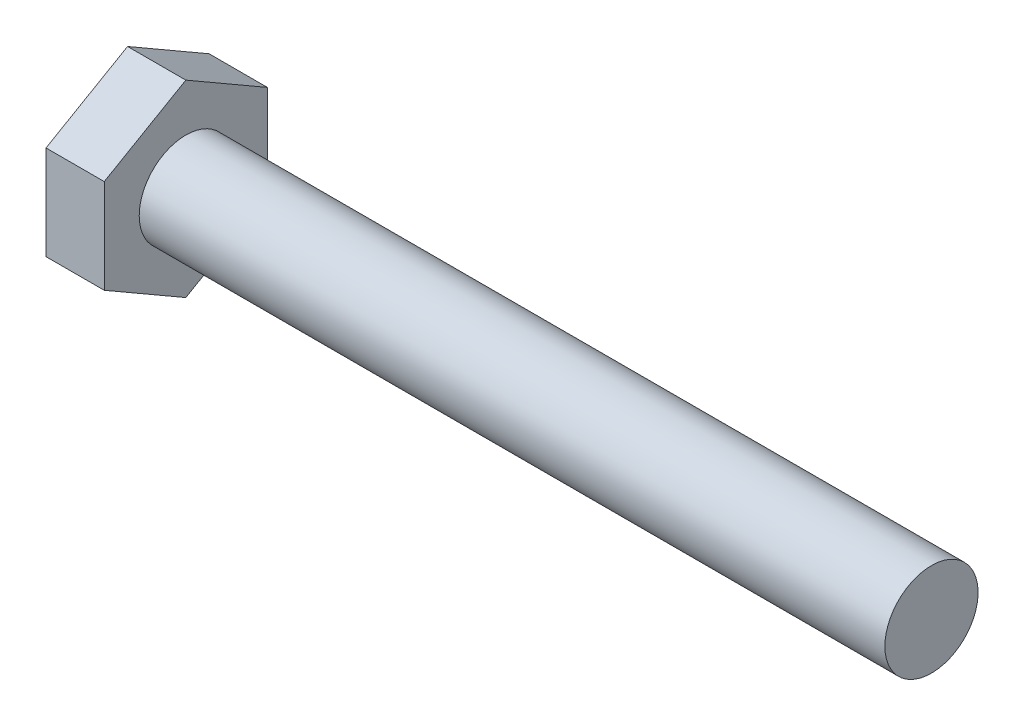
ISO-10303-21;
HEADER;
FILE_DESCRIPTION(('STEP AP214'),'2;1');
FILE_NAME('part.step','',(''),(''),'','','');
FILE_SCHEMA(('AUTOMOTIVE_DESIGN { 1 0 10303 214 1 1 1 1 }'));
ENDSEC;
DATA;
#1=APPLICATION_CONTEXT('core data for automotive mechanical design processes');
#2=APPLICATION_PROTOCOL_DEFINITION('international standard','automotive_design',2000,#1);
#3=PRODUCT_CONTEXT('',#1,'mechanical');
#4=PRODUCT('Part','Part','',(#3));
#5=PRODUCT_RELATED_PRODUCT_CATEGORY('part','',(#4));
#6=PRODUCT_DEFINITION_FORMATION('','',#4);
#7=PRODUCT_DEFINITION_CONTEXT('part definition',#1,'design');
#8=PRODUCT_DEFINITION('design','',#6,#7);
#9=PRODUCT_DEFINITION_SHAPE('','',#8);
#10=(LENGTH_UNIT() NAMED_UNIT(*) SI_UNIT(.MILLI.,.METRE.));
#11=(NAMED_UNIT(*) PLANE_ANGLE_UNIT() SI_UNIT($,.RADIAN.));
#12=(NAMED_UNIT(*) SI_UNIT($,.STERADIAN.) SOLID_ANGLE_UNIT());
#13=UNCERTAINTY_MEASURE_WITH_UNIT(LENGTH_MEASURE(1.E-05),#10,'distance_accuracy_value','');
#14=(GEOMETRIC_REPRESENTATION_CONTEXT(3) GLOBAL_UNCERTAINTY_ASSIGNED_CONTEXT((#13)) GLOBAL_UNIT_ASSIGNED_CONTEXT((#10,
#11,#12)) REPRESENTATION_CONTEXT('',''));
#15=CARTESIAN_POINT('',(0.,0.,0.));
#16=DIRECTION('',(0.,0.,1.));
#17=DIRECTION('',(1.,0.,0.));
#18=AXIS2_PLACEMENT_3D('',#15,#16,#17);
#19=CARTESIAN_POINT('',(-23.415625,0.,0.));
#20=DIRECTION('',(1.,0.,0.));
#21=DIRECTION('',(0.,0.,1.));
#22=AXIS2_PLACEMENT_3D('',#19,#20,#21);
#23=CYLINDRICAL_SURFACE('',#22,3.175);
#24=CARTESIAN_POINT('',(-23.415625,0.,0.));
#25=DIRECTION('',(1.,0.,0.));
#26=DIRECTION('',(0.,0.,-1.));
#27=AXIS2_PLACEMENT_3D('',#24,#25,#26);
#28=CIRCLE('',#27,3.175);
#29=CARTESIAN_POINT('',(-23.415625,0.,-3.175));
#30=VERTEX_POINT('',#29);
#31=EDGE_CURVE('E53',#30,#30,#28,.F.);
#32=ORIENTED_EDGE('',*,*,#31,.F.);
#33=EDGE_LOOP('',(#32));
#34=FACE_BOUND('',#33,.T.);
#35=CARTESIAN_POINT('',(27.384375,0.,0.));
#36=DIRECTION('',(-1.,0.,0.));
#37=DIRECTION('',(0.,0.,1.));
#38=AXIS2_PLACEMENT_3D('',#35,#36,#37);
#39=CIRCLE('',#38,3.175);
#40=CARTESIAN_POINT('',(27.384375,0.,3.175));
#41=VERTEX_POINT('',#40);
#42=EDGE_CURVE('E11',#41,#41,#39,.T.);
#43=ORIENTED_EDGE('',*,*,#42,.T.);
#44=EDGE_LOOP('',(#43));
#45=FACE_BOUND('',#44,.T.);
#46=ADVANCED_FACE('F45',(#34,#45),#23,.T.);
#47=CARTESIAN_POINT('',(27.384375,0.,0.));
#48=DIRECTION('',(1.,0.,0.));
#49=DIRECTION('',(0.,0.,1.));
#50=AXIS2_PLACEMENT_3D('',#47,#48,#49);
#51=PLANE('',#50);
#52=ORIENTED_EDGE('',*,*,#42,.F.);
#53=EDGE_LOOP('',(#52));
#54=FACE_BOUND('',#53,.T.);
#55=ADVANCED_FACE('F156',(#54),#51,.T.);
#56=CARTESIAN_POINT('',(-27.384375,-3.20790243318485,-5.55625));
#57=DIRECTION('',(0.,0.,1.));
#58=DIRECTION('',(-1.,0.,0.));
#59=AXIS2_PLACEMENT_3D('',#56,#57,#58);
#60=PLANE('',#59);
#61=DIRECTION('',(0.,1.,0.));
#62=VECTOR('',#61,1.);
#63=CARTESIAN_POINT('',(-23.415625,-3.20790243318485,-5.55625));
#64=LINE('',#63,#62);
#65=CARTESIAN_POINT('',(-23.415625,-3.20790243318485,-5.55625));
#66=VERTEX_POINT('',#65);
#67=CARTESIAN_POINT('',(-23.415625,3.20790243318486,-5.55625));
#68=VERTEX_POINT('',#67);
#69=EDGE_CURVE('E128',#66,#68,#64,.T.);
#70=ORIENTED_EDGE('',*,*,#69,.F.);
#71=DIRECTION('',(1.,0.,0.));
#72=VECTOR('',#71,1.);
#73=CARTESIAN_POINT('',(-27.384375,-3.20790243318485,-5.55625));
#74=LINE('',#73,#72);
#75=CARTESIAN_POINT('',(-27.384375,-3.20790243318485,-5.55625));
#76=VERTEX_POINT('',#75);
#77=EDGE_CURVE('E127',#76,#66,#74,.T.);
#78=ORIENTED_EDGE('',*,*,#77,.F.);
#79=DIRECTION('',(0.,1.,0.));
#80=VECTOR('',#79,1.);
#81=CARTESIAN_POINT('',(-27.384375,-3.20790243318485,-5.55625));
#82=LINE('',#81,#80);
#83=CARTESIAN_POINT('',(-27.384375,3.20790243318486,-5.55625));
#84=VERTEX_POINT('',#83);
#85=EDGE_CURVE('E140',#76,#84,#82,.T.);
#86=ORIENTED_EDGE('',*,*,#85,.T.);
#87=DIRECTION('',(1.,0.,0.));
#88=VECTOR('',#87,1.);
#89=CARTESIAN_POINT('',(-27.384375,3.20790243318486,-5.55625));
#90=LINE('',#89,#88);
#91=EDGE_CURVE('E147',#84,#68,#90,.T.);
#92=ORIENTED_EDGE('',*,*,#91,.T.);
#93=EDGE_LOOP('',(#70,#78,#86,#92));
#94=FACE_BOUND('',#93,.T.);
#95=ADVANCED_FACE('F160',(#94),#60,.F.);
#96=CARTESIAN_POINT('',(-27.384375,3.20790243318486,-5.55625));
#97=DIRECTION('',(0.,-0.866025403784438,0.5));
#98=DIRECTION('',(0.,0.5,0.866025403784439));
#99=AXIS2_PLACEMENT_3D('',#96,#97,#98);
#100=PLANE('',#99);
#101=DIRECTION('',(0.,0.5,0.866025403784438));
#102=VECTOR('',#101,1.);
#103=CARTESIAN_POINT('',(-23.415625,3.20790243318486,-5.55625));
#104=LINE('',#103,#102);
#105=CARTESIAN_POINT('',(-23.415625,6.41580486636972,0.));
#106=VERTEX_POINT('',#105);
#107=EDGE_CURVE('E130',#68,#106,#104,.T.);
#108=ORIENTED_EDGE('',*,*,#107,.F.);
#109=ORIENTED_EDGE('',*,*,#91,.F.);
#110=DIRECTION('',(0.,0.5,0.866025403784438));
#111=VECTOR('',#110,1.);
#112=CARTESIAN_POINT('',(-27.384375,3.20790243318486,-5.55625));
#113=LINE('',#112,#111);
#114=CARTESIAN_POINT('',(-27.384375,6.41580486636972,0.));
#115=VERTEX_POINT('',#114);
#116=EDGE_CURVE('E93',#84,#115,#113,.T.);
#117=ORIENTED_EDGE('',*,*,#116,.T.);
#118=DIRECTION('',(1.,0.,0.));
#119=VECTOR('',#118,1.);
#120=CARTESIAN_POINT('',(-27.384375,6.41580486636972,0.));
#121=LINE('',#120,#119);
#122=EDGE_CURVE('E144',#115,#106,#121,.T.);
#123=ORIENTED_EDGE('',*,*,#122,.T.);
#124=EDGE_LOOP('',(#108,#109,#117,#123));
#125=FACE_BOUND('',#124,.T.);
#126=ADVANCED_FACE('F164',(#125),#100,.F.);
#127=CARTESIAN_POINT('',(-27.384375,6.41580486636972,0.));
#128=DIRECTION('',(0.,-0.866025403784439,-0.5));
#129=DIRECTION('',(0.,-0.5,0.866025403784439));
#130=AXIS2_PLACEMENT_3D('',#127,#128,#129);
#131=PLANE('',#130);
#132=DIRECTION('',(0.,-0.5,0.866025403784439));
#133=VECTOR('',#132,1.);
#134=CARTESIAN_POINT('',(-23.415625,6.41580486636972,0.));
#135=LINE('',#134,#133);
#136=CARTESIAN_POINT('',(-23.415625,3.20790243318486,5.55625));
#137=VERTEX_POINT('',#136);
#138=EDGE_CURVE('E133',#106,#137,#135,.T.);
#139=ORIENTED_EDGE('',*,*,#138,.F.);
#140=ORIENTED_EDGE('',*,*,#122,.F.);
#141=DIRECTION('',(0.,-0.5,0.866025403784439));
#142=VECTOR('',#141,1.);
#143=CARTESIAN_POINT('',(-27.384375,6.41580486636972,0.));
#144=LINE('',#143,#142);
#145=CARTESIAN_POINT('',(-27.384375,3.20790243318486,5.55625));
#146=VERTEX_POINT('',#145);
#147=EDGE_CURVE('E121',#115,#146,#144,.T.);
#148=ORIENTED_EDGE('',*,*,#147,.T.);
#149=DIRECTION('',(1.,0.,0.));
#150=VECTOR('',#149,1.);
#151=CARTESIAN_POINT('',(-27.384375,3.20790243318486,5.55625));
#152=LINE('',#151,#150);
#153=EDGE_CURVE('E115',#146,#137,#152,.T.);
#154=ORIENTED_EDGE('',*,*,#153,.T.);
#155=EDGE_LOOP('',(#139,#140,#148,#154));
#156=FACE_BOUND('',#155,.T.);
#157=ADVANCED_FACE('F170',(#156),#131,.F.);
#158=CARTESIAN_POINT('',(-27.384375,3.20790243318486,5.55625));
#159=DIRECTION('',(0.,0.,-1.));
#160=DIRECTION('',(1.,0.,0.));
#161=AXIS2_PLACEMENT_3D('',#158,#159,#160);
#162=PLANE('',#161);
#163=DIRECTION('',(0.,-1.,0.));
#164=VECTOR('',#163,1.);
#165=CARTESIAN_POINT('',(-23.415625,3.20790243318486,5.55625));
#166=LINE('',#165,#164);
#167=CARTESIAN_POINT('',(-23.415625,-3.20790243318486,5.55625));
#168=VERTEX_POINT('',#167);
#169=EDGE_CURVE('E136',#137,#168,#166,.T.);
#170=ORIENTED_EDGE('',*,*,#169,.F.);
#171=ORIENTED_EDGE('',*,*,#153,.F.);
#172=DIRECTION('',(0.,-1.,0.));
#173=VECTOR('',#172,1.);
#174=CARTESIAN_POINT('',(-27.384375,3.20790243318486,5.55625));
#175=LINE('',#174,#173);
#176=CARTESIAN_POINT('',(-27.384375,-3.20790243318486,5.55625));
#177=VERTEX_POINT('',#176);
#178=EDGE_CURVE('E105',#146,#177,#175,.T.);
#179=ORIENTED_EDGE('',*,*,#178,.T.);
#180=DIRECTION('',(1.,0.,0.));
#181=VECTOR('',#180,1.);
#182=CARTESIAN_POINT('',(-27.384375,-3.20790243318486,5.55625));
#183=LINE('',#182,#181);
#184=EDGE_CURVE('E110',#177,#168,#183,.T.);
#185=ORIENTED_EDGE('',*,*,#184,.T.);
#186=EDGE_LOOP('',(#170,#171,#179,#185));
#187=FACE_BOUND('',#186,.T.);
#188=ADVANCED_FACE('F118',(#187),#162,.F.);
#189=CARTESIAN_POINT('',(-27.384375,-3.20790243318486,5.55625));
#190=DIRECTION('',(0.,0.866025403784439,-0.5));
#191=DIRECTION('',(0.,-0.5,-0.866025403784439));
#192=AXIS2_PLACEMENT_3D('',#189,#190,#191);
#193=PLANE('',#192);
#194=DIRECTION('',(0.,-0.5,-0.866025403784439));
#195=VECTOR('',#194,1.);
#196=CARTESIAN_POINT('',(-23.415625,-3.20790243318486,5.55625));
#197=LINE('',#196,#195);
#198=CARTESIAN_POINT('',(-23.415625,-6.41580486636971,0.));
#199=VERTEX_POINT('',#198);
#200=EDGE_CURVE('E112',#168,#199,#197,.T.);
#201=ORIENTED_EDGE('',*,*,#200,.F.);
#202=ORIENTED_EDGE('',*,*,#184,.F.);
#203=DIRECTION('',(0.,-0.5,-0.866025403784439));
#204=VECTOR('',#203,1.);
#205=CARTESIAN_POINT('',(-27.384375,-3.20790243318486,5.55625));
#206=LINE('',#205,#204);
#207=CARTESIAN_POINT('',(-27.384375,-6.41580486636971,0.));
#208=VERTEX_POINT('',#207);
#209=EDGE_CURVE('E101',#177,#208,#206,.T.);
#210=ORIENTED_EDGE('',*,*,#209,.T.);
#211=DIRECTION('',(1.,0.,0.));
#212=VECTOR('',#211,1.);
#213=CARTESIAN_POINT('',(-27.384375,-6.41580486636971,0.));
#214=LINE('',#213,#212);
#215=EDGE_CURVE('E116',#208,#199,#214,.T.);
#216=ORIENTED_EDGE('',*,*,#215,.T.);
#217=EDGE_LOOP('',(#201,#202,#210,#216));
#218=FACE_BOUND('',#217,.T.);
#219=ADVANCED_FACE('F111',(#218),#193,.F.);
#220=CARTESIAN_POINT('',(-27.384375,-6.41580486636971,0.));
#221=DIRECTION('',(0.,0.866025403784439,0.5));
#222=DIRECTION('',(0.,0.5,-0.866025403784439));
#223=AXIS2_PLACEMENT_3D('',#220,#221,#222);
#224=PLANE('',#223);
#225=DIRECTION('',(0.,0.5,-0.866025403784439));
#226=VECTOR('',#225,1.);
#227=CARTESIAN_POINT('',(-23.415625,-6.41580486636971,0.));
#228=LINE('',#227,#226);
#229=EDGE_CURVE('E81',#199,#66,#228,.T.);
#230=ORIENTED_EDGE('',*,*,#229,.F.);
#231=ORIENTED_EDGE('',*,*,#215,.F.);
#232=DIRECTION('',(0.,0.5,-0.866025403784439));
#233=VECTOR('',#232,1.);
#234=CARTESIAN_POINT('',(-27.384375,-6.41580486636971,0.));
#235=LINE('',#234,#233);
#236=EDGE_CURVE('E61',#208,#76,#235,.T.);
#237=ORIENTED_EDGE('',*,*,#236,.T.);
#238=ORIENTED_EDGE('',*,*,#77,.T.);
#239=EDGE_LOOP('',(#230,#231,#237,#238));
#240=FACE_BOUND('',#239,.T.);
#241=ADVANCED_FACE('F179',(#240),#224,.F.);
#242=CARTESIAN_POINT('',(-27.384375,3.20790243318486,-5.55625));
#243=DIRECTION('',(-1.,0.,0.));
#244=DIRECTION('',(0.,0.,-1.));
#245=AXIS2_PLACEMENT_3D('',#242,#243,#244);
#246=PLANE('',#245);
#247=ORIENTED_EDGE('',*,*,#85,.F.);
#248=ORIENTED_EDGE('',*,*,#236,.F.);
#249=ORIENTED_EDGE('',*,*,#209,.F.);
#250=ORIENTED_EDGE('',*,*,#178,.F.);
#251=ORIENTED_EDGE('',*,*,#147,.F.);
#252=ORIENTED_EDGE('',*,*,#116,.F.);
#253=EDGE_LOOP('',(#247,#248,#249,#250,#251,#252));
#254=FACE_BOUND('',#253,.T.);
#255=ADVANCED_FACE('F103',(#254),#246,.T.);
#256=CARTESIAN_POINT('',(-23.415625,3.20790243318486,-5.55625));
#257=DIRECTION('',(-1.,0.,0.));
#258=DIRECTION('',(0.,0.,-1.));
#259=AXIS2_PLACEMENT_3D('',#256,#257,#258);
#260=PLANE('',#259);
#261=ORIENTED_EDGE('',*,*,#31,.T.);
#262=EDGE_LOOP('',(#261));
#263=FACE_BOUND('',#262,.T.);
#264=ORIENTED_EDGE('',*,*,#69,.T.);
#265=ORIENTED_EDGE('',*,*,#107,.T.);
#266=ORIENTED_EDGE('',*,*,#138,.T.);
#267=ORIENTED_EDGE('',*,*,#169,.T.);
#268=ORIENTED_EDGE('',*,*,#200,.T.);
#269=ORIENTED_EDGE('',*,*,#229,.T.);
#270=EDGE_LOOP('',(#264,#265,#266,#267,#268,#269));
#271=FACE_BOUND('',#270,.T.);
#272=ADVANCED_FACE('F152',(#263,#271),#260,.F.);
#273=CLOSED_SHELL('',(#46,#55,#95,#126,#157,#188,#219,#241,#255,#272));
#274=MANIFOLD_SOLID_BREP('B2',#273);
#275=ADVANCED_BREP_SHAPE_REPRESENTATION('',(#18,#274),#14);
#276=SHAPE_DEFINITION_REPRESENTATION(#9,#275);
ENDSEC;
END-ISO-10303-21;
